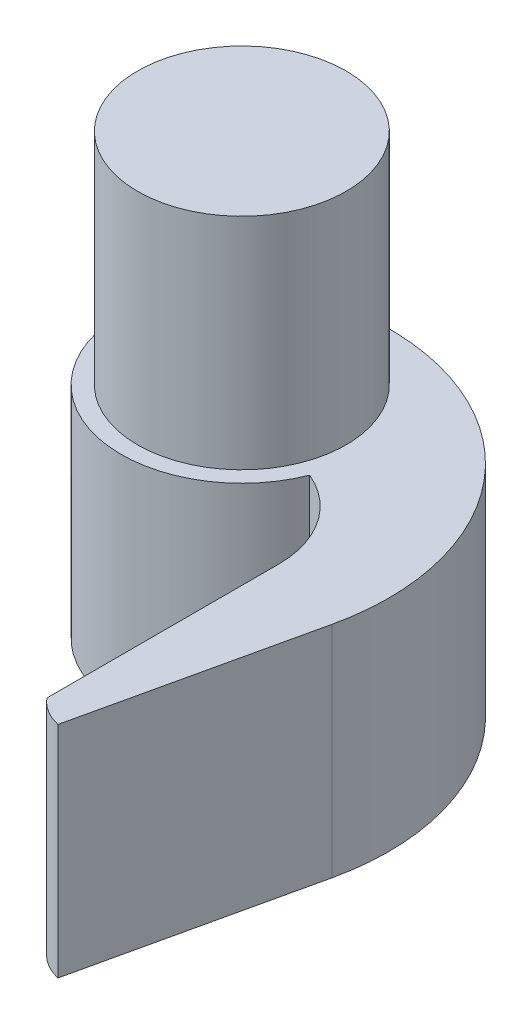
ISO-10303-21;
HEADER;
FILE_DESCRIPTION(('STEP AP214'),'2;1');
FILE_NAME('part.step','',(''),(''),'','','');
FILE_SCHEMA(('AUTOMOTIVE_DESIGN { 1 0 10303 214 1 1 1 1 }'));
ENDSEC;
DATA;
#1=APPLICATION_CONTEXT('core data for automotive mechanical design processes');
#2=APPLICATION_PROTOCOL_DEFINITION('international standard','automotive_design',2000,#1);
#3=PRODUCT_CONTEXT('',#1,'mechanical');
#4=PRODUCT('Part','Part','',(#3));
#5=PRODUCT_RELATED_PRODUCT_CATEGORY('part','',(#4));
#6=PRODUCT_DEFINITION_FORMATION('','',#4);
#7=PRODUCT_DEFINITION_CONTEXT('part definition',#1,'design');
#8=PRODUCT_DEFINITION('design','',#6,#7);
#9=PRODUCT_DEFINITION_SHAPE('','',#8);
#10=(LENGTH_UNIT() NAMED_UNIT(*) SI_UNIT(.MILLI.,.METRE.));
#11=(NAMED_UNIT(*) PLANE_ANGLE_UNIT() SI_UNIT($,.RADIAN.));
#12=(NAMED_UNIT(*) SI_UNIT($,.STERADIAN.) SOLID_ANGLE_UNIT());
#13=UNCERTAINTY_MEASURE_WITH_UNIT(LENGTH_MEASURE(1.E-05),#10,'distance_accuracy_value','');
#14=(GEOMETRIC_REPRESENTATION_CONTEXT(3) GLOBAL_UNCERTAINTY_ASSIGNED_CONTEXT((#13)) GLOBAL_UNIT_ASSIGNED_CONTEXT((#10,
#11,#12)) REPRESENTATION_CONTEXT('',''));
#15=CARTESIAN_POINT('',(0.,0.,0.));
#16=DIRECTION('',(0.,0.,1.));
#17=DIRECTION('',(1.,0.,0.));
#18=AXIS2_PLACEMENT_3D('',#15,#16,#17);
#19=CARTESIAN_POINT('',(19.4578777462422,20.,30.5814100525998));
#20=DIRECTION('',(0.,-1.,0.));
#21=DIRECTION('',(0.,0.,-1.));
#22=AXIS2_PLACEMENT_3D('',#19,#20,#21);
#23=CYLINDRICAL_SURFACE('',#22,4.71068136707812);
#24=CARTESIAN_POINT('',(19.4578777462422,0.,30.5814100525998));
#25=DIRECTION('',(0.,1.,0.));
#26=DIRECTION('',(0.,0.,-1.));
#27=AXIS2_PLACEMENT_3D('',#24,#25,#26);
#28=CIRCLE('',#27,4.71068136707812);
#29=CARTESIAN_POINT('',(15.8330571777441,0.,33.589930417884));
#30=VERTEX_POINT('',#29);
#31=CARTESIAN_POINT('',(18.4245412724948,0.,35.177357688742));
#32=VERTEX_POINT('',#31);
#33=EDGE_CURVE('E129',#30,#32,#28,.T.);
#34=ORIENTED_EDGE('',*,*,#33,.T.);
#35=DIRECTION('',(0.,-1.,0.));
#36=VECTOR('',#35,1.);
#37=CARTESIAN_POINT('',(18.4245412724948,20.,35.177357688742));
#38=LINE('',#37,#36);
#39=CARTESIAN_POINT('',(18.4245412724948,20.,35.177357688742));
#40=VERTEX_POINT('',#39);
#41=EDGE_CURVE('E48',#40,#32,#38,.T.);
#42=ORIENTED_EDGE('',*,*,#41,.F.);
#43=CARTESIAN_POINT('',(19.4578777462422,20.,30.5814100525998));
#44=DIRECTION('',(0.,1.,0.));
#45=DIRECTION('',(0.,0.,-1.));
#46=AXIS2_PLACEMENT_3D('',#43,#44,#45);
#47=CIRCLE('',#46,4.71068136707812);
#48=CARTESIAN_POINT('',(15.8330571777441,20.,33.589930417884));
#49=VERTEX_POINT('',#48);
#50=EDGE_CURVE('E146',#49,#40,#47,.T.);
#51=ORIENTED_EDGE('',*,*,#50,.F.);
#52=DIRECTION('',(0.,-1.,0.));
#53=VECTOR('',#52,1.);
#54=CARTESIAN_POINT('',(15.8330571777441,20.,33.589930417884));
#55=LINE('',#54,#53);
#56=EDGE_CURVE('E125',#49,#30,#55,.T.);
#57=ORIENTED_EDGE('',*,*,#56,.T.);
#58=EDGE_LOOP('',(#34,#42,#51,#57));
#59=FACE_BOUND('',#58,.T.);
#60=ADVANCED_FACE('F39',(#59),#23,.T.);
#61=CARTESIAN_POINT('',(18.4245412724948,20.,35.177357688742));
#62=DIRECTION('',(-0.975643920274919,0.,-0.219360299121303));
#63=DIRECTION('',(-0.219360299121303,0.,0.975643920274919));
#64=AXIS2_PLACEMENT_3D('',#61,#62,#63);
#65=PLANE('',#64);
#66=DIRECTION('',(0.219360299121303,0.,-0.975643920274919));
#67=VECTOR('',#66,1.);
#68=CARTESIAN_POINT('',(18.4245412724948,0.,35.177357688742));
#69=LINE('',#68,#67);
#70=CARTESIAN_POINT('',(23.0059943177965,0.,14.8005309448931));
#71=VERTEX_POINT('',#70);
#72=EDGE_CURVE('E133',#32,#71,#69,.T.);
#73=ORIENTED_EDGE('',*,*,#72,.T.);
#74=DIRECTION('',(0.,-1.,0.));
#75=VECTOR('',#74,1.);
#76=CARTESIAN_POINT('',(23.0059943177965,20.,14.8005309448931));
#77=LINE('',#76,#75);
#78=CARTESIAN_POINT('',(23.0059943177965,20.,14.8005309448931));
#79=VERTEX_POINT('',#78);
#80=EDGE_CURVE('E153',#79,#71,#77,.T.);
#81=ORIENTED_EDGE('',*,*,#80,.F.);
#82=DIRECTION('',(0.219360299121303,0.,-0.975643920274919));
#83=VECTOR('',#82,1.);
#84=CARTESIAN_POINT('',(18.4245412724948,20.,35.177357688742));
#85=LINE('',#84,#83);
#86=EDGE_CURVE('E94',#40,#79,#85,.T.);
#87=ORIENTED_EDGE('',*,*,#86,.F.);
#88=ORIENTED_EDGE('',*,*,#41,.T.);
#89=EDGE_LOOP('',(#73,#81,#87,#88));
#90=FACE_BOUND('',#89,.T.);
#91=ADVANCED_FACE('F158',(#90),#65,.F.);
#92=CARTESIAN_POINT('',(2.26541768259489,20.,10.1372936714378));
#93=DIRECTION('',(0.,-1.,0.));
#94=DIRECTION('',(0.,0.,-1.));
#95=AXIS2_PLACEMENT_3D('',#92,#93,#94);
#96=CYLINDRICAL_SURFACE('',#95,21.2583466203093);
#97=CARTESIAN_POINT('',(2.26541768259489,0.,10.1372936714378));
#98=DIRECTION('',(0.,1.,0.));
#99=DIRECTION('',(0.,0.,1.));
#100=AXIS2_PLACEMENT_3D('',#97,#98,#99);
#101=CIRCLE('',#100,21.2583466203093);
#102=CARTESIAN_POINT('',(0.,0.,-11.));
#103=VERTEX_POINT('',#102);
#104=EDGE_CURVE('E137',#71,#103,#101,.T.);
#105=ORIENTED_EDGE('',*,*,#104,.T.);
#106=DIRECTION('',(0.,-1.,0.));
#107=VECTOR('',#106,1.);
#108=CARTESIAN_POINT('',(0.,20.,-11.));
#109=LINE('',#108,#107);
#110=CARTESIAN_POINT('',(0.,20.,-11.));
#111=VERTEX_POINT('',#110);
#112=EDGE_CURVE('E118',#111,#103,#109,.T.);
#113=ORIENTED_EDGE('',*,*,#112,.F.);
#114=CARTESIAN_POINT('',(2.26541768259489,20.,10.1372936714378));
#115=DIRECTION('',(0.,1.,0.));
#116=DIRECTION('',(0.,0.,1.));
#117=AXIS2_PLACEMENT_3D('',#114,#115,#116);
#118=CIRCLE('',#117,21.2583466203093);
#119=EDGE_CURVE('E107',#79,#111,#118,.T.);
#120=ORIENTED_EDGE('',*,*,#119,.F.);
#121=ORIENTED_EDGE('',*,*,#80,.T.);
#122=EDGE_LOOP('',(#105,#113,#120,#121));
#123=FACE_BOUND('',#122,.T.);
#124=ADVANCED_FACE('F166',(#123),#96,.T.);
#125=CARTESIAN_POINT('',(0.,20.,0.));
#126=DIRECTION('',(0.,-1.,0.));
#127=DIRECTION('',(0.,0.,-1.));
#128=AXIS2_PLACEMENT_3D('',#125,#126,#127);
#129=CYLINDRICAL_SURFACE('',#128,11.);
#130=CARTESIAN_POINT('',(0.,0.,0.));
#131=DIRECTION('',(0.,1.,0.));
#132=DIRECTION('',(0.,0.,1.));
#133=AXIS2_PLACEMENT_3D('',#130,#131,#132);
#134=CIRCLE('',#133,11.);
#135=CARTESIAN_POINT('',(10.2278698948714,0.,4.04854015832654));
#136=VERTEX_POINT('',#135);
#137=EDGE_CURVE('E116',#103,#136,#134,.T.);
#138=ORIENTED_EDGE('',*,*,#137,.T.);
#139=DIRECTION('',(0.,-1.,0.));
#140=VECTOR('',#139,1.);
#141=CARTESIAN_POINT('',(10.2278698948714,20.,4.04854015832654));
#142=LINE('',#141,#140);
#143=CARTESIAN_POINT('',(10.2278698948714,20.,4.04854015832654));
#144=VERTEX_POINT('',#143);
#145=EDGE_CURVE('E113',#144,#136,#142,.T.);
#146=ORIENTED_EDGE('',*,*,#145,.F.);
#147=CARTESIAN_POINT('',(0.,20.,0.));
#148=DIRECTION('',(0.,1.,0.));
#149=DIRECTION('',(0.,0.,1.));
#150=AXIS2_PLACEMENT_3D('',#147,#148,#149);
#151=CIRCLE('',#150,11.);
#152=EDGE_CURVE('E101',#111,#144,#151,.T.);
#153=ORIENTED_EDGE('',*,*,#152,.F.);
#154=ORIENTED_EDGE('',*,*,#112,.T.);
#155=EDGE_LOOP('',(#138,#146,#153,#154));
#156=FACE_BOUND('',#155,.T.);
#157=ADVANCED_FACE('F114',(#156),#129,.T.);
#158=CARTESIAN_POINT('',(6.67701045397746,20.,12.4880063048794));
#159=DIRECTION('',(0.,-1.,0.));
#160=DIRECTION('',(0.,0.,-1.));
#161=AXIS2_PLACEMENT_3D('',#158,#159,#160);
#162=CYLINDRICAL_SURFACE('',#161,9.15604672376662);
#163=CARTESIAN_POINT('',(6.67701045397746,0.,12.4880063048794));
#164=DIRECTION('',(0.,-1.,0.));
#165=DIRECTION('',(0.,0.,1.));
#166=AXIS2_PLACEMENT_3D('',#163,#164,#165);
#167=CIRCLE('',#166,9.15604672376662);
#168=CARTESIAN_POINT('',(15.8330571777441,0.,12.4880063048794));
#169=VERTEX_POINT('',#168);
#170=EDGE_CURVE('E79',#136,#169,#167,.T.);
#171=ORIENTED_EDGE('',*,*,#170,.T.);
#172=DIRECTION('',(0.,-1.,0.));
#173=VECTOR('',#172,1.);
#174=CARTESIAN_POINT('',(15.8330571777441,20.,12.4880063048794));
#175=LINE('',#174,#173);
#176=CARTESIAN_POINT('',(15.8330571777441,20.,12.4880063048794));
#177=VERTEX_POINT('',#176);
#178=EDGE_CURVE('E119',#177,#169,#175,.T.);
#179=ORIENTED_EDGE('',*,*,#178,.F.);
#180=CARTESIAN_POINT('',(6.67701045397746,20.,12.4880063048794));
#181=DIRECTION('',(0.,-1.,0.));
#182=DIRECTION('',(0.,0.,1.));
#183=AXIS2_PLACEMENT_3D('',#180,#181,#182);
#184=CIRCLE('',#183,9.15604672376662);
#185=EDGE_CURVE('E105',#144,#177,#184,.T.);
#186=ORIENTED_EDGE('',*,*,#185,.F.);
#187=ORIENTED_EDGE('',*,*,#145,.T.);
#188=EDGE_LOOP('',(#171,#179,#186,#187));
#189=FACE_BOUND('',#188,.T.);
#190=ADVANCED_FACE('F121',(#189),#162,.F.);
#191=CARTESIAN_POINT('',(15.8330571777441,20.,33.589930417884));
#192=DIRECTION('',(1.,0.,0.));
#193=DIRECTION('',(0.,0.,-1.));
#194=AXIS2_PLACEMENT_3D('',#191,#192,#193);
#195=PLANE('',#194);
#196=DIRECTION('',(0.,0.,1.));
#197=VECTOR('',#196,1.);
#198=CARTESIAN_POINT('',(15.8330571777441,0.,33.589930417884));
#199=LINE('',#198,#197);
#200=EDGE_CURVE('E85',#169,#30,#199,.T.);
#201=ORIENTED_EDGE('',*,*,#200,.T.);
#202=ORIENTED_EDGE('',*,*,#56,.F.);
#203=DIRECTION('',(0.,0.,1.));
#204=VECTOR('',#203,1.);
#205=CARTESIAN_POINT('',(15.8330571777441,20.,33.589930417884));
#206=LINE('',#205,#204);
#207=EDGE_CURVE('E56',#177,#49,#206,.T.);
#208=ORIENTED_EDGE('',*,*,#207,.F.);
#209=ORIENTED_EDGE('',*,*,#178,.T.);
#210=EDGE_LOOP('',(#201,#202,#208,#209));
#211=FACE_BOUND('',#210,.T.);
#212=ADVANCED_FACE('F186',(#211),#195,.F.);
#213=CARTESIAN_POINT('',(19.4578777462422,20.,30.5814100525998));
#214=DIRECTION('',(0.,-1.,0.));
#215=DIRECTION('',(0.,0.,-1.));
#216=AXIS2_PLACEMENT_3D('',#213,#214,#215);
#217=PLANE('',#216);
#218=CARTESIAN_POINT('',(0.,20.,0.));
#219=DIRECTION('',(0.,-1.,0.));
#220=DIRECTION('',(0.,0.,-1.));
#221=AXIS2_PLACEMENT_3D('',#218,#219,#220);
#222=CIRCLE('',#221,9.5);
#223=CARTESIAN_POINT('',(0.,20.,-9.5));
#224=VERTEX_POINT('',#223);
#225=EDGE_CURVE('E11',#224,#224,#222,.F.);
#226=ORIENTED_EDGE('',*,*,#225,.F.);
#227=EDGE_LOOP('',(#226));
#228=FACE_BOUND('',#227,.T.);
#229=ORIENTED_EDGE('',*,*,#50,.T.);
#230=ORIENTED_EDGE('',*,*,#86,.T.);
#231=ORIENTED_EDGE('',*,*,#119,.T.);
#232=ORIENTED_EDGE('',*,*,#152,.T.);
#233=ORIENTED_EDGE('',*,*,#185,.T.);
#234=ORIENTED_EDGE('',*,*,#207,.T.);
#235=EDGE_LOOP('',(#229,#230,#231,#232,#233,#234));
#236=FACE_BOUND('',#235,.T.);
#237=ADVANCED_FACE('F103',(#228,#236),#217,.F.);
#238=CARTESIAN_POINT('',(19.4578777462422,0.,30.5814100525998));
#239=DIRECTION('',(0.,-1.,0.));
#240=DIRECTION('',(0.,0.,-1.));
#241=AXIS2_PLACEMENT_3D('',#238,#239,#240);
#242=PLANE('',#241);
#243=ORIENTED_EDGE('',*,*,#33,.F.);
#244=ORIENTED_EDGE('',*,*,#200,.F.);
#245=ORIENTED_EDGE('',*,*,#170,.F.);
#246=ORIENTED_EDGE('',*,*,#137,.F.);
#247=ORIENTED_EDGE('',*,*,#104,.F.);
#248=ORIENTED_EDGE('',*,*,#72,.F.);
#249=EDGE_LOOP('',(#243,#244,#245,#246,#247,#248));
#250=FACE_BOUND('',#249,.T.);
#251=ADVANCED_FACE('F163',(#250),#242,.T.);
#252=CARTESIAN_POINT('',(0.,40.,0.));
#253=DIRECTION('',(0.,-1.,0.));
#254=DIRECTION('',(0.,0.,-1.));
#255=AXIS2_PLACEMENT_3D('',#252,#253,#254);
#256=CYLINDRICAL_SURFACE('',#255,9.5);
#257=CARTESIAN_POINT('',(0.,40.,0.));
#258=DIRECTION('',(0.,1.,0.));
#259=DIRECTION('',(0.,0.,1.));
#260=AXIS2_PLACEMENT_3D('',#257,#258,#259);
#261=CIRCLE('',#260,9.5);
#262=CARTESIAN_POINT('',(0.,40.,9.5));
#263=VERTEX_POINT('',#262);
#264=EDGE_CURVE('E134',#263,#263,#261,.T.);
#265=ORIENTED_EDGE('',*,*,#264,.F.);
#266=EDGE_LOOP('',(#265));
#267=FACE_BOUND('',#266,.T.);
#268=ORIENTED_EDGE('',*,*,#225,.T.);
#269=EDGE_LOOP('',(#268));
#270=FACE_BOUND('',#269,.T.);
#271=ADVANCED_FACE('F179',(#267,#270),#256,.T.);
#272=CARTESIAN_POINT('',(0.,40.,0.));
#273=DIRECTION('',(0.,1.,0.));
#274=DIRECTION('',(0.,0.,1.));
#275=AXIS2_PLACEMENT_3D('',#272,#273,#274);
#276=PLANE('',#275);
#277=ORIENTED_EDGE('',*,*,#264,.T.);
#278=EDGE_LOOP('',(#277));
#279=FACE_BOUND('',#278,.T.);
#280=ADVANCED_FACE('F177',(#279),#276,.T.);
#281=CLOSED_SHELL('',(#60,#91,#124,#157,#190,#212,#237,#251,#271,#280));
#282=MANIFOLD_SOLID_BREP('B2',#281);
#283=ADVANCED_BREP_SHAPE_REPRESENTATION('',(#18,#282),#14);
#284=SHAPE_DEFINITION_REPRESENTATION(#9,#283);
ENDSEC;
END-ISO-10303-21;
